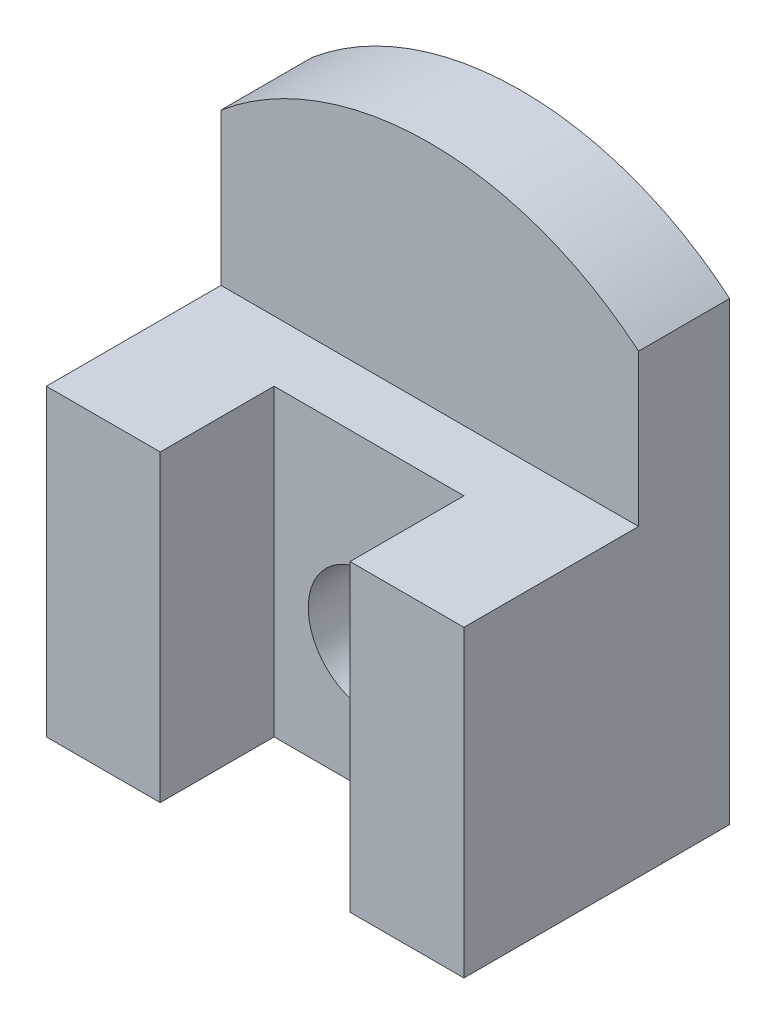
ISO-10303-21;
HEADER;
FILE_DESCRIPTION(('STEP AP214'),'2;1');
FILE_NAME('part.step','',(''),(''),'','','');
FILE_SCHEMA(('AUTOMOTIVE_DESIGN { 1 0 10303 214 1 1 1 1 }'));
ENDSEC;
DATA;
#1=APPLICATION_CONTEXT('core data for automotive mechanical design processes');
#2=APPLICATION_PROTOCOL_DEFINITION('international standard','automotive_design',2000,#1);
#3=PRODUCT_CONTEXT('',#1,'mechanical');
#4=PRODUCT('Part','Part','',(#3));
#5=PRODUCT_RELATED_PRODUCT_CATEGORY('part','',(#4));
#6=PRODUCT_DEFINITION_FORMATION('','',#4);
#7=PRODUCT_DEFINITION_CONTEXT('part definition',#1,'design');
#8=PRODUCT_DEFINITION('design','',#6,#7);
#9=PRODUCT_DEFINITION_SHAPE('','',#8);
#10=(LENGTH_UNIT() NAMED_UNIT(*) SI_UNIT(.MILLI.,.METRE.));
#11=(NAMED_UNIT(*) PLANE_ANGLE_UNIT() SI_UNIT($,.RADIAN.));
#12=(NAMED_UNIT(*) SI_UNIT($,.STERADIAN.) SOLID_ANGLE_UNIT());
#13=UNCERTAINTY_MEASURE_WITH_UNIT(LENGTH_MEASURE(1.E-05),#10,'distance_accuracy_value','');
#14=(GEOMETRIC_REPRESENTATION_CONTEXT(3) GLOBAL_UNCERTAINTY_ASSIGNED_CONTEXT((#13)) GLOBAL_UNIT_ASSIGNED_CONTEXT((#10,
#11,#12)) REPRESENTATION_CONTEXT('',''));
#15=CARTESIAN_POINT('',(0.,0.,0.));
#16=DIRECTION('',(0.,0.,1.));
#17=DIRECTION('',(1.,0.,0.));
#18=AXIS2_PLACEMENT_3D('',#15,#16,#17);
#19=CARTESIAN_POINT('',(-32.5,-32.8125,35.));
#20=DIRECTION('',(0.,0.,1.));
#21=DIRECTION('',(1.,0.,0.));
#22=AXIS2_PLACEMENT_3D('',#19,#20,#21);
#23=PLANE('',#22);
#24=DIRECTION('',(0.,1.,0.));
#25=VECTOR('',#24,1.);
#26=CARTESIAN_POINT('',(-20.,-32.8125,35.));
#27=LINE('',#26,#25);
#28=CARTESIAN_POINT('',(-20.,-60.,35.));
#29=VERTEX_POINT('',#28);
#30=CARTESIAN_POINT('',(-20.,-20.,35.));
#31=VERTEX_POINT('',#30);
#32=EDGE_CURVE('E147',#29,#31,#27,.T.);
#33=ORIENTED_EDGE('',*,*,#32,.F.);
#34=DIRECTION('',(1.,0.,0.));
#35=VECTOR('',#34,1.);
#36=CARTESIAN_POINT('',(-60.,-60.,35.));
#37=LINE('',#36,#35);
#38=CARTESIAN_POINT('',(-5.,-60.,35.));
#39=VERTEX_POINT('',#38);
#40=EDGE_CURVE('E174',#29,#39,#37,.T.);
#41=ORIENTED_EDGE('',*,*,#40,.T.);
#42=DIRECTION('',(0.,1.,0.));
#43=VECTOR('',#42,1.);
#44=CARTESIAN_POINT('',(-5.,-60.,35.));
#45=LINE('',#44,#43);
#46=CARTESIAN_POINT('',(-5.,-20.,35.));
#47=VERTEX_POINT('',#46);
#48=EDGE_CURVE('E177',#39,#47,#45,.T.);
#49=ORIENTED_EDGE('',*,*,#48,.T.);
#50=DIRECTION('',(1.,0.,0.));
#51=VECTOR('',#50,1.);
#52=CARTESIAN_POINT('',(-32.5,-20.,35.));
#53=LINE('',#52,#51);
#54=EDGE_CURVE('E190',#31,#47,#53,.T.);
#55=ORIENTED_EDGE('',*,*,#54,.F.);
#56=EDGE_LOOP('',(#33,#41,#49,#55));
#57=FACE_BOUND('',#56,.T.);
#58=ADVANCED_FACE('F41',(#57),#23,.T.);
#59=CARTESIAN_POINT('',(-32.5,-32.8125,35.));
#60=DIRECTION('',(0.,0.,-1.));
#61=DIRECTION('',(-1.,0.,0.));
#62=AXIS2_PLACEMENT_3D('',#59,#60,#61);
#63=CYLINDRICAL_SURFACE('',#62,42.8125);
#64=CARTESIAN_POINT('',(-32.5,-32.8125,12.));
#65=DIRECTION('',(0.,0.,-1.));
#66=DIRECTION('',(0.,1.,0.));
#67=AXIS2_PLACEMENT_3D('',#64,#65,#66);
#68=CIRCLE('',#67,42.8125);
#69=CARTESIAN_POINT('',(-60.,0.,12.));
#70=VERTEX_POINT('',#69);
#71=CARTESIAN_POINT('',(-5.,0.,12.));
#72=VERTEX_POINT('',#71);
#73=EDGE_CURVE('E160',#70,#72,#68,.T.);
#74=ORIENTED_EDGE('',*,*,#73,.T.);
#75=DIRECTION('',(0.,0.,-1.));
#76=VECTOR('',#75,1.);
#77=CARTESIAN_POINT('',(-5.,0.,35.));
#78=LINE('',#77,#76);
#79=CARTESIAN_POINT('',(-5.,0.,0.));
#80=VERTEX_POINT('',#79);
#81=EDGE_CURVE('E180',#72,#80,#78,.T.);
#82=ORIENTED_EDGE('',*,*,#81,.T.);
#83=CARTESIAN_POINT('',(-32.5,-32.8125,0.));
#84=DIRECTION('',(0.,0.,1.));
#85=DIRECTION('',(1.,0.,0.));
#86=AXIS2_PLACEMENT_3D('',#83,#84,#85);
#87=CIRCLE('',#86,42.8125);
#88=CARTESIAN_POINT('',(-60.,0.,0.));
#89=VERTEX_POINT('',#88);
#90=EDGE_CURVE('E162',#80,#89,#87,.T.);
#91=ORIENTED_EDGE('',*,*,#90,.T.);
#92=DIRECTION('',(0.,0.,-1.));
#93=VECTOR('',#92,1.);
#94=CARTESIAN_POINT('',(-60.,0.,35.));
#95=LINE('',#94,#93);
#96=EDGE_CURVE('E188',#70,#89,#95,.T.);
#97=ORIENTED_EDGE('',*,*,#96,.F.);
#98=EDGE_LOOP('',(#74,#82,#91,#97));
#99=FACE_BOUND('',#98,.T.);
#100=ADVANCED_FACE('F43',(#99),#63,.T.);
#101=CARTESIAN_POINT('',(-60.,0.,35.));
#102=DIRECTION('',(1.,0.,0.));
#103=DIRECTION('',(0.,1.,0.));
#104=AXIS2_PLACEMENT_3D('',#101,#102,#103);
#105=PLANE('',#104);
#106=DIRECTION('',(0.,-1.,0.));
#107=VECTOR('',#106,1.);
#108=CARTESIAN_POINT('',(-60.,0.,35.));
#109=LINE('',#108,#107);
#110=CARTESIAN_POINT('',(-60.,-20.,35.));
#111=VERTEX_POINT('',#110);
#112=CARTESIAN_POINT('',(-60.,-60.,35.));
#113=VERTEX_POINT('',#112);
#114=EDGE_CURVE('E172',#111,#113,#109,.T.);
#115=ORIENTED_EDGE('',*,*,#114,.F.);
#116=DIRECTION('',(0.,0.,1.));
#117=VECTOR('',#116,1.);
#118=CARTESIAN_POINT('',(-60.,-20.,12.));
#119=LINE('',#118,#117);
#120=CARTESIAN_POINT('',(-60.,-20.,12.));
#121=VERTEX_POINT('',#120);
#122=EDGE_CURVE('E64',#121,#111,#119,.T.);
#123=ORIENTED_EDGE('',*,*,#122,.F.);
#124=DIRECTION('',(0.,-1.,0.));
#125=VECTOR('',#124,1.);
#126=CARTESIAN_POINT('',(-60.,9.99999999999999,12.));
#127=LINE('',#126,#125);
#128=EDGE_CURVE('E149',#70,#121,#127,.T.);
#129=ORIENTED_EDGE('',*,*,#128,.F.);
#130=ORIENTED_EDGE('',*,*,#96,.T.);
#131=DIRECTION('',(0.,-1.,0.));
#132=VECTOR('',#131,1.);
#133=CARTESIAN_POINT('',(-60.,0.,0.));
#134=LINE('',#133,#132);
#135=CARTESIAN_POINT('',(-60.,-60.,0.));
#136=VERTEX_POINT('',#135);
#137=EDGE_CURVE('E165',#89,#136,#134,.T.);
#138=ORIENTED_EDGE('',*,*,#137,.T.);
#139=DIRECTION('',(0.,0.,-1.));
#140=VECTOR('',#139,1.);
#141=CARTESIAN_POINT('',(-60.,-60.,35.));
#142=LINE('',#141,#140);
#143=EDGE_CURVE('E185',#113,#136,#142,.T.);
#144=ORIENTED_EDGE('',*,*,#143,.F.);
#145=EDGE_LOOP('',(#115,#123,#129,#130,#138,#144));
#146=FACE_BOUND('',#145,.T.);
#147=ADVANCED_FACE('F232',(#146),#105,.F.);
#148=CARTESIAN_POINT('',(-60.,-60.,35.));
#149=DIRECTION('',(0.,1.,0.));
#150=DIRECTION('',(0.,0.,1.));
#151=AXIS2_PLACEMENT_3D('',#148,#149,#150);
#152=PLANE('',#151);
#153=ORIENTED_EDGE('',*,*,#40,.F.);
#154=DIRECTION('',(0.,0.,1.));
#155=VECTOR('',#154,1.);
#156=CARTESIAN_POINT('',(-20.,-60.,20.));
#157=LINE('',#156,#155);
#158=CARTESIAN_POINT('',(-20.,-60.,20.));
#159=VERTEX_POINT('',#158);
#160=EDGE_CURVE('E127',#159,#29,#157,.T.);
#161=ORIENTED_EDGE('',*,*,#160,.F.);
#162=DIRECTION('',(1.,0.,0.));
#163=VECTOR('',#162,1.);
#164=CARTESIAN_POINT('',(-45.,-60.,20.));
#165=LINE('',#164,#163);
#166=CARTESIAN_POINT('',(-45.,-60.,20.));
#167=VERTEX_POINT('',#166);
#168=EDGE_CURVE('E122',#167,#159,#165,.T.);
#169=ORIENTED_EDGE('',*,*,#168,.F.);
#170=DIRECTION('',(0.,0.,-1.));
#171=VECTOR('',#170,1.);
#172=CARTESIAN_POINT('',(-45.,-60.,40.));
#173=LINE('',#172,#171);
#174=CARTESIAN_POINT('',(-45.,-60.,35.));
#175=VERTEX_POINT('',#174);
#176=EDGE_CURVE('E130',#175,#167,#173,.T.);
#177=ORIENTED_EDGE('',*,*,#176,.F.);
#178=EDGE_CURVE('E175',#113,#175,#37,.T.);
#179=ORIENTED_EDGE('',*,*,#178,.F.);
#180=ORIENTED_EDGE('',*,*,#143,.T.);
#181=DIRECTION('',(1.,0.,0.));
#182=VECTOR('',#181,1.);
#183=CARTESIAN_POINT('',(-60.,-60.,0.));
#184=LINE('',#183,#182);
#185=CARTESIAN_POINT('',(-5.,-60.,0.));
#186=VERTEX_POINT('',#185);
#187=EDGE_CURVE('E167',#136,#186,#184,.T.);
#188=ORIENTED_EDGE('',*,*,#187,.T.);
#189=DIRECTION('',(0.,0.,-1.));
#190=VECTOR('',#189,1.);
#191=CARTESIAN_POINT('',(-5.,-60.,35.));
#192=LINE('',#191,#190);
#193=EDGE_CURVE('E182',#39,#186,#192,.T.);
#194=ORIENTED_EDGE('',*,*,#193,.F.);
#195=EDGE_LOOP('',(#153,#161,#169,#177,#179,#180,#188,#194));
#196=FACE_BOUND('',#195,.T.);
#197=ADVANCED_FACE('F140',(#196),#152,.F.);
#198=CARTESIAN_POINT('',(-5.,-60.,35.));
#199=DIRECTION('',(-1.,0.,0.));
#200=DIRECTION('',(0.,-1.,0.));
#201=AXIS2_PLACEMENT_3D('',#198,#199,#200);
#202=PLANE('',#201);
#203=DIRECTION('',(0.,-1.,0.));
#204=VECTOR('',#203,1.);
#205=CARTESIAN_POINT('',(-5.,10.,12.));
#206=LINE('',#205,#204);
#207=CARTESIAN_POINT('',(-5.,-20.,12.));
#208=VERTEX_POINT('',#207);
#209=EDGE_CURVE('E152',#72,#208,#206,.T.);
#210=ORIENTED_EDGE('',*,*,#209,.T.);
#211=DIRECTION('',(0.,0.,1.));
#212=VECTOR('',#211,1.);
#213=CARTESIAN_POINT('',(-5.,-20.,12.));
#214=LINE('',#213,#212);
#215=EDGE_CURVE('E155',#208,#47,#214,.T.);
#216=ORIENTED_EDGE('',*,*,#215,.T.);
#217=ORIENTED_EDGE('',*,*,#48,.F.);
#218=ORIENTED_EDGE('',*,*,#193,.T.);
#219=DIRECTION('',(0.,1.,0.));
#220=VECTOR('',#219,1.);
#221=CARTESIAN_POINT('',(-5.,-60.,0.));
#222=LINE('',#221,#220);
#223=EDGE_CURVE('E169',#186,#80,#222,.T.);
#224=ORIENTED_EDGE('',*,*,#223,.T.);
#225=ORIENTED_EDGE('',*,*,#81,.F.);
#226=EDGE_LOOP('',(#210,#216,#217,#218,#224,#225));
#227=FACE_BOUND('',#226,.T.);
#228=ADVANCED_FACE('F210',(#227),#202,.F.);
#229=DIRECTION('',(0.,-1.,0.));
#230=VECTOR('',#229,1.);
#231=CARTESIAN_POINT('',(-45.,-32.8125,35.));
#232=LINE('',#231,#230);
#233=CARTESIAN_POINT('',(-45.,-20.,35.));
#234=VERTEX_POINT('',#233);
#235=EDGE_CURVE('E133',#234,#175,#232,.T.);
#236=ORIENTED_EDGE('',*,*,#235,.F.);
#237=EDGE_CURVE('E191',#111,#234,#53,.T.);
#238=ORIENTED_EDGE('',*,*,#237,.F.);
#239=ORIENTED_EDGE('',*,*,#114,.T.);
#240=ORIENTED_EDGE('',*,*,#178,.T.);
#241=EDGE_LOOP('',(#236,#238,#239,#240));
#242=FACE_BOUND('',#241,.T.);
#243=ADVANCED_FACE('F197',(#242),#23,.T.);
#244=CARTESIAN_POINT('',(-32.5,-32.8125,0.));
#245=DIRECTION('',(0.,0.,1.));
#246=DIRECTION('',(1.,0.,0.));
#247=AXIS2_PLACEMENT_3D('',#244,#245,#246);
#248=PLANE('',#247);
#249=CARTESIAN_POINT('',(-32.5,-43.,0.));
#250=DIRECTION('',(0.,0.,1.));
#251=DIRECTION('',(1.,0.,0.));
#252=AXIS2_PLACEMENT_3D('',#249,#250,#251);
#253=CIRCLE('',#252,8.);
#254=CARTESIAN_POINT('',(-24.5,-43.,0.));
#255=VERTEX_POINT('',#254);
#256=EDGE_CURVE('E137',#255,#255,#253,.T.);
#257=ORIENTED_EDGE('',*,*,#256,.T.);
#258=EDGE_LOOP('',(#257));
#259=FACE_BOUND('',#258,.T.);
#260=ORIENTED_EDGE('',*,*,#90,.F.);
#261=ORIENTED_EDGE('',*,*,#223,.F.);
#262=ORIENTED_EDGE('',*,*,#187,.F.);
#263=ORIENTED_EDGE('',*,*,#137,.F.);
#264=EDGE_LOOP('',(#260,#261,#262,#263));
#265=FACE_BOUND('',#264,.T.);
#266=ADVANCED_FACE('F207',(#259,#265),#248,.F.);
#267=CARTESIAN_POINT('',(-5.,10.,12.));
#268=DIRECTION('',(0.,0.,-1.));
#269=DIRECTION('',(0.,1.,0.));
#270=AXIS2_PLACEMENT_3D('',#267,#268,#269);
#271=PLANE('',#270);
#272=ORIENTED_EDGE('',*,*,#73,.F.);
#273=ORIENTED_EDGE('',*,*,#128,.T.);
#274=DIRECTION('',(-1.,0.,0.));
#275=VECTOR('',#274,1.);
#276=CARTESIAN_POINT('',(-5.,-20.,12.));
#277=LINE('',#276,#275);
#278=EDGE_CURVE('E158',#208,#121,#277,.T.);
#279=ORIENTED_EDGE('',*,*,#278,.F.);
#280=ORIENTED_EDGE('',*,*,#209,.F.);
#281=EDGE_LOOP('',(#272,#273,#279,#280));
#282=FACE_BOUND('',#281,.T.);
#283=ADVANCED_FACE('F241',(#282),#271,.F.);
#284=CARTESIAN_POINT('',(-5.,-20.,12.));
#285=DIRECTION('',(0.,-1.,0.));
#286=DIRECTION('',(1.,0.,0.));
#287=AXIS2_PLACEMENT_3D('',#284,#285,#286);
#288=PLANE('',#287);
#289=DIRECTION('',(1.,0.,0.));
#290=VECTOR('',#289,1.);
#291=CARTESIAN_POINT('',(-5.,-20.,20.));
#292=LINE('',#291,#290);
#293=CARTESIAN_POINT('',(-45.,-20.,20.));
#294=VERTEX_POINT('',#293);
#295=CARTESIAN_POINT('',(-20.,-20.,20.));
#296=VERTEX_POINT('',#295);
#297=EDGE_CURVE('E49',#294,#296,#292,.T.);
#298=ORIENTED_EDGE('',*,*,#297,.T.);
#299=DIRECTION('',(0.,0.,1.));
#300=VECTOR('',#299,1.);
#301=CARTESIAN_POINT('',(-20.,-20.,12.));
#302=LINE('',#301,#300);
#303=EDGE_CURVE('E13',#296,#31,#302,.T.);
#304=ORIENTED_EDGE('',*,*,#303,.T.);
#305=ORIENTED_EDGE('',*,*,#54,.T.);
#306=ORIENTED_EDGE('',*,*,#215,.F.);
#307=ORIENTED_EDGE('',*,*,#278,.T.);
#308=ORIENTED_EDGE('',*,*,#122,.T.);
#309=ORIENTED_EDGE('',*,*,#237,.T.);
#310=DIRECTION('',(0.,0.,-1.));
#311=VECTOR('',#310,1.);
#312=CARTESIAN_POINT('',(-45.,-20.,12.));
#313=LINE('',#312,#311);
#314=EDGE_CURVE('E193',#234,#294,#313,.T.);
#315=ORIENTED_EDGE('',*,*,#314,.T.);
#316=EDGE_LOOP('',(#298,#304,#305,#306,#307,#308,#309,#315));
#317=FACE_BOUND('',#316,.T.);
#318=ADVANCED_FACE('F194',(#317),#288,.F.);
#319=CARTESIAN_POINT('',(-45.,10.,20.));
#320=DIRECTION('',(0.,0.,-1.));
#321=DIRECTION('',(-1.,0.,0.));
#322=AXIS2_PLACEMENT_3D('',#319,#320,#321);
#323=PLANE('',#322);
#324=CARTESIAN_POINT('',(-32.5,-43.,20.));
#325=DIRECTION('',(0.,0.,1.));
#326=DIRECTION('',(1.,0.,0.));
#327=AXIS2_PLACEMENT_3D('',#324,#325,#326);
#328=CIRCLE('',#327,8.);
#329=CARTESIAN_POINT('',(-24.5,-43.,20.));
#330=VERTEX_POINT('',#329);
#331=EDGE_CURVE('E288',#330,#330,#328,.T.);
#332=ORIENTED_EDGE('',*,*,#331,.F.);
#333=EDGE_LOOP('',(#332));
#334=FACE_BOUND('',#333,.T.);
#335=DIRECTION('',(0.,-1.,0.));
#336=VECTOR('',#335,1.);
#337=CARTESIAN_POINT('',(-45.,10.,20.));
#338=LINE('',#337,#336);
#339=EDGE_CURVE('E56',#294,#167,#338,.T.);
#340=ORIENTED_EDGE('',*,*,#339,.T.);
#341=ORIENTED_EDGE('',*,*,#168,.T.);
#342=DIRECTION('',(0.,-1.,0.));
#343=VECTOR('',#342,1.);
#344=CARTESIAN_POINT('',(-20.,10.,20.));
#345=LINE('',#344,#343);
#346=EDGE_CURVE('E126',#296,#159,#345,.T.);
#347=ORIENTED_EDGE('',*,*,#346,.F.);
#348=ORIENTED_EDGE('',*,*,#297,.F.);
#349=EDGE_LOOP('',(#340,#341,#347,#348));
#350=FACE_BOUND('',#349,.T.);
#351=ADVANCED_FACE('F119',(#334,#350),#323,.F.);
#352=CARTESIAN_POINT('',(-20.,10.,20.));
#353=DIRECTION('',(1.,0.,0.));
#354=DIRECTION('',(0.,0.,-1.));
#355=AXIS2_PLACEMENT_3D('',#352,#353,#354);
#356=PLANE('',#355);
#357=ORIENTED_EDGE('',*,*,#32,.T.);
#358=ORIENTED_EDGE('',*,*,#303,.F.);
#359=ORIENTED_EDGE('',*,*,#346,.T.);
#360=ORIENTED_EDGE('',*,*,#160,.T.);
#361=EDGE_LOOP('',(#357,#358,#359,#360));
#362=FACE_BOUND('',#361,.T.);
#363=ADVANCED_FACE('F215',(#362),#356,.F.);
#364=CARTESIAN_POINT('',(-45.,10.,40.));
#365=DIRECTION('',(-1.,0.,0.));
#366=DIRECTION('',(0.,0.,1.));
#367=AXIS2_PLACEMENT_3D('',#364,#365,#366);
#368=PLANE('',#367);
#369=ORIENTED_EDGE('',*,*,#235,.T.);
#370=ORIENTED_EDGE('',*,*,#176,.T.);
#371=ORIENTED_EDGE('',*,*,#339,.F.);
#372=ORIENTED_EDGE('',*,*,#314,.F.);
#373=EDGE_LOOP('',(#369,#370,#371,#372));
#374=FACE_BOUND('',#373,.T.);
#375=ADVANCED_FACE('F131',(#374),#368,.F.);
#376=CARTESIAN_POINT('',(-32.5,-43.,0.));
#377=DIRECTION('',(0.,0.,1.));
#378=DIRECTION('',(1.,0.,0.));
#379=AXIS2_PLACEMENT_3D('',#376,#377,#378);
#380=CYLINDRICAL_SURFACE('',#379,8.);
#381=CARTESIAN_POINT('',(-24.5,-43.,0.));
#382=CARTESIAN_POINT('',(-24.5,-43.,0.208333333333333));
#383=CARTESIAN_POINT('',(-24.5,-43.,0.416666666666667));
#384=CARTESIAN_POINT('',(-24.5,-43.,0.833333333333334));
#385=CARTESIAN_POINT('',(-24.5,-43.,1.04166666666667));
#386=CARTESIAN_POINT('',(-24.5,-43.,1.45833333333333));
#387=CARTESIAN_POINT('',(-24.5,-43.,1.66666666666667));
#388=CARTESIAN_POINT('',(-24.5,-43.,2.08333333333333));
#389=CARTESIAN_POINT('',(-24.5,-43.,2.29166666666667));
#390=CARTESIAN_POINT('',(-24.5,-43.,2.70833333333333));
#391=CARTESIAN_POINT('',(-24.5,-43.,2.91666666666667));
#392=CARTESIAN_POINT('',(-24.5,-43.,3.33333333333333));
#393=CARTESIAN_POINT('',(-24.5,-43.,3.54166666666667));
#394=CARTESIAN_POINT('',(-24.5,-43.,3.95833333333333));
#395=CARTESIAN_POINT('',(-24.5,-43.,4.16666666666667));
#396=CARTESIAN_POINT('',(-24.5,-43.,4.58333333333333));
#397=CARTESIAN_POINT('',(-24.5,-43.,4.79166666666667));
#398=CARTESIAN_POINT('',(-24.5,-43.,5.20833333333334));
#399=CARTESIAN_POINT('',(-24.5,-43.,5.41666666666667));
#400=CARTESIAN_POINT('',(-24.5,-43.,5.83333333333334));
#401=CARTESIAN_POINT('',(-24.5,-43.,6.04166666666667));
#402=CARTESIAN_POINT('',(-24.5,-43.,6.45833333333334));
#403=CARTESIAN_POINT('',(-24.5,-43.,6.66666666666667));
#404=CARTESIAN_POINT('',(-24.5,-43.,7.08333333333334));
#405=CARTESIAN_POINT('',(-24.5,-43.,7.29166666666667));
#406=CARTESIAN_POINT('',(-24.5,-43.,7.70833333333334));
#407=CARTESIAN_POINT('',(-24.5,-43.,7.91666666666667));
#408=CARTESIAN_POINT('',(-24.5,-43.,8.33333333333334));
#409=CARTESIAN_POINT('',(-24.5,-43.,8.54166666666667));
#410=CARTESIAN_POINT('',(-24.5,-43.,8.95833333333334));
#411=CARTESIAN_POINT('',(-24.5,-43.,9.16666666666667));
#412=CARTESIAN_POINT('',(-24.5,-43.,9.58333333333334));
#413=CARTESIAN_POINT('',(-24.5,-43.,9.79166666666667));
#414=CARTESIAN_POINT('',(-24.5,-43.,10.2083333333333));
#415=CARTESIAN_POINT('',(-24.5,-43.,10.4166666666667));
#416=CARTESIAN_POINT('',(-24.5,-43.,10.8333333333333));
#417=CARTESIAN_POINT('',(-24.5,-43.,11.0416666666667));
#418=CARTESIAN_POINT('',(-24.5,-43.,11.4583333333333));
#419=CARTESIAN_POINT('',(-24.5,-43.,11.6666666666667));
#420=CARTESIAN_POINT('',(-24.5,-43.,12.0833333333333));
#421=CARTESIAN_POINT('',(-24.5,-43.,12.2916666666667));
#422=CARTESIAN_POINT('',(-24.5,-43.,12.7083333333333));
#423=CARTESIAN_POINT('',(-24.5,-43.,12.9166666666667));
#424=CARTESIAN_POINT('',(-24.5,-43.,13.3333333333333));
#425=CARTESIAN_POINT('',(-24.5,-43.,13.5416666666667));
#426=CARTESIAN_POINT('',(-24.5,-43.,13.9583333333333));
#427=CARTESIAN_POINT('',(-24.5,-43.,14.1666666666667));
#428=CARTESIAN_POINT('',(-24.5,-43.,14.5833333333333));
#429=CARTESIAN_POINT('',(-24.5,-43.,14.7916666666667));
#430=CARTESIAN_POINT('',(-24.5,-43.,15.2083333333333));
#431=CARTESIAN_POINT('',(-24.5,-43.,15.4166666666667));
#432=CARTESIAN_POINT('',(-24.5,-43.,15.8333333333333));
#433=CARTESIAN_POINT('',(-24.5,-43.,16.0416666666667));
#434=CARTESIAN_POINT('',(-24.5,-43.,16.4583333333333));
#435=CARTESIAN_POINT('',(-24.5,-43.,16.6666666666667));
#436=CARTESIAN_POINT('',(-24.5,-43.,17.0833333333333));
#437=CARTESIAN_POINT('',(-24.5,-43.,17.2916666666667));
#438=CARTESIAN_POINT('',(-24.5,-43.,17.7083333333333));
#439=CARTESIAN_POINT('',(-24.5,-43.,17.9166666666667));
#440=CARTESIAN_POINT('',(-24.5,-43.,18.3333333333333));
#441=CARTESIAN_POINT('',(-24.5,-43.,18.5416666666667));
#442=CARTESIAN_POINT('',(-24.5,-43.,18.9583333333333));
#443=CARTESIAN_POINT('',(-24.5,-43.,19.1666666666667));
#444=CARTESIAN_POINT('',(-24.5,-43.,19.5833333333333));
#445=CARTESIAN_POINT('',(-24.5,-43.,19.7916666666667));
#446=CARTESIAN_POINT('',(-24.5,-43.,20.));
#447=B_SPLINE_CURVE_WITH_KNOTS('',3,(#381,#382,#383,#384,#385,#386,#387,#388,#389,#390,#391,
#392,#393,#394,#395,#396,#397,#398,#399,#400,#401,#402,#403,#404,#405,#406,#407,#408,#409,#410,
#411,#412,#413,#414,#415,#416,#417,#418,#419,#420,#421,#422,#423,#424,#425,#426,#427,#428,#429,
#430,#431,#432,#433,#434,#435,#436,#437,#438,#439,#440,#441,#442,#443,#444,#445,#446),
.UNSPECIFIED.,.F.,.F.,(4,2,2,2,2,2,2,2,2,2,2,2,2,2,2,2,2,2,2,2,2,2,2,2,2,2,2,2,2,2,2,2,4),(0.,
0.625,1.25,1.875,2.5,3.125,3.75,4.375,5.,5.625,6.25,6.875,7.5,8.125,8.75,9.375,10.,10.625,11.25,
11.875,12.5,13.125,13.75,14.375,15.,15.625,16.25,16.875,17.5,18.125,18.75,19.375,20.),.UNSPECIFIED.);
#448=EDGE_CURVE('BSEAM222',#255,#330,#447,.T.);
#449=ORIENTED_EDGE('',*,*,#256,.F.);
#450=ORIENTED_EDGE('',*,*,#331,.T.);
#451=ORIENTED_EDGE('',*,*,#448,.T.);
#452=ORIENTED_EDGE('',*,*,#448,.F.);
#453=EDGE_LOOP('',(#449,#451,#450,#452));
#454=FACE_BOUND('',#453,.T.);
#455=ADVANCED_FACE('F222',(#454),#380,.F.);
#456=CLOSED_SHELL('',(#58,#100,#147,#197,#228,#243,#266,#283,#318,#351,#363,#375,#455));
#457=MANIFOLD_SOLID_BREP('B2',#456);
#458=ADVANCED_BREP_SHAPE_REPRESENTATION('',(#18,#457),#14);
#459=SHAPE_DEFINITION_REPRESENTATION(#9,#458);
ENDSEC;
END-ISO-10303-21;
